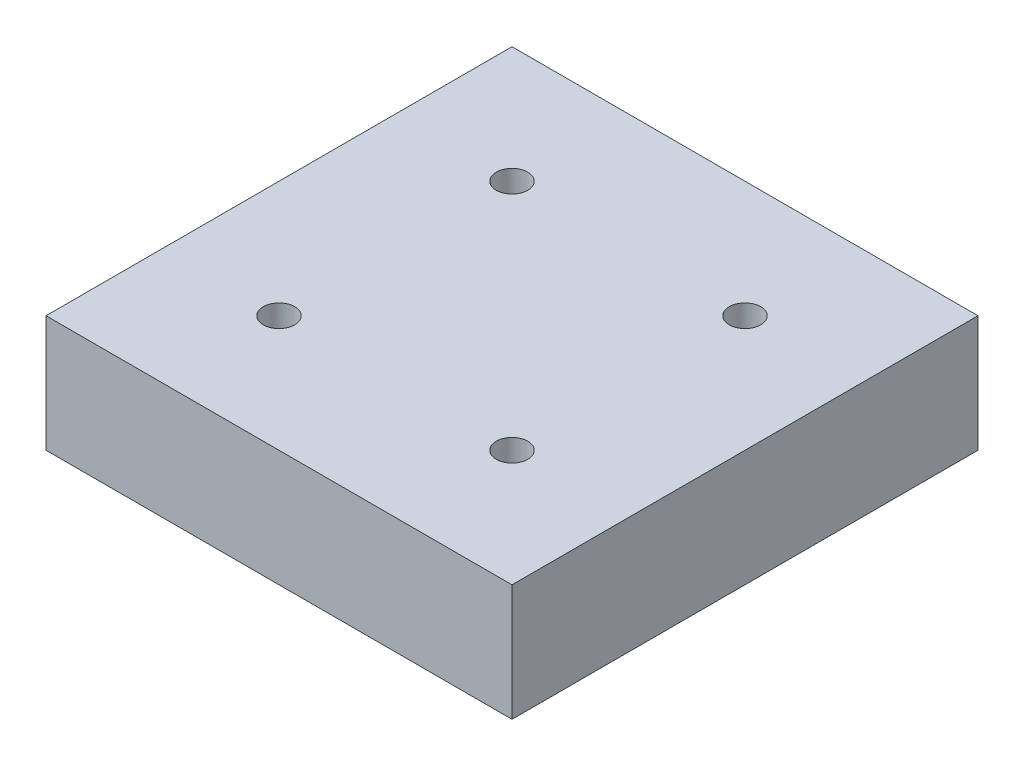
ISO-10303-21;
HEADER;
FILE_DESCRIPTION(('STEP AP214'),'2;1');
FILE_NAME('part.step','',(''),(''),'','','');
FILE_SCHEMA(('AUTOMOTIVE_DESIGN { 1 0 10303 214 1 1 1 1 }'));
ENDSEC;
DATA;
#1=APPLICATION_CONTEXT('core data for automotive mechanical design processes');
#2=APPLICATION_PROTOCOL_DEFINITION('international standard','automotive_design',2000,#1);
#3=PRODUCT_CONTEXT('',#1,'mechanical');
#4=PRODUCT('Part','Part','',(#3));
#5=PRODUCT_RELATED_PRODUCT_CATEGORY('part','',(#4));
#6=PRODUCT_DEFINITION_FORMATION('','',#4);
#7=PRODUCT_DEFINITION_CONTEXT('part definition',#1,'design');
#8=PRODUCT_DEFINITION('design','',#6,#7);
#9=PRODUCT_DEFINITION_SHAPE('','',#8);
#10=(LENGTH_UNIT() NAMED_UNIT(*) SI_UNIT(.MILLI.,.METRE.));
#11=(NAMED_UNIT(*) PLANE_ANGLE_UNIT() SI_UNIT($,.RADIAN.));
#12=(NAMED_UNIT(*) SI_UNIT($,.STERADIAN.) SOLID_ANGLE_UNIT());
#13=UNCERTAINTY_MEASURE_WITH_UNIT(LENGTH_MEASURE(1.E-05),#10,'distance_accuracy_value','');
#14=(GEOMETRIC_REPRESENTATION_CONTEXT(3) GLOBAL_UNCERTAINTY_ASSIGNED_CONTEXT((#13)) GLOBAL_UNIT_ASSIGNED_CONTEXT((#10,
#11,#12)) REPRESENTATION_CONTEXT('',''));
#15=CARTESIAN_POINT('',(0.,0.,0.));
#16=DIRECTION('',(0.,0.,1.));
#17=DIRECTION('',(1.,0.,0.));
#18=AXIS2_PLACEMENT_3D('',#15,#16,#17);
#19=CARTESIAN_POINT('',(0.,10.,0.));
#20=DIRECTION('',(0.,-1.,0.));
#21=DIRECTION('',(0.,0.,-1.));
#22=AXIS2_PLACEMENT_3D('',#19,#20,#21);
#23=PLANE('',#22);
#24=DIRECTION('',(-1.,0.,0.));
#25=VECTOR('',#24,1.);
#26=CARTESIAN_POINT('',(-20.,10.,-20.));
#27=LINE('',#26,#25);
#28=CARTESIAN_POINT('',(20.,10.,-20.));
#29=VERTEX_POINT('',#28);
#30=CARTESIAN_POINT('',(-20.,10.,-20.));
#31=VERTEX_POINT('',#30);
#32=EDGE_CURVE('E97',#29,#31,#27,.T.);
#33=ORIENTED_EDGE('',*,*,#32,.T.);
#34=DIRECTION('',(0.,0.,1.));
#35=VECTOR('',#34,1.);
#36=CARTESIAN_POINT('',(-20.,10.,20.));
#37=LINE('',#36,#35);
#38=CARTESIAN_POINT('',(-20.,10.,20.));
#39=VERTEX_POINT('',#38);
#40=EDGE_CURVE('E169',#31,#39,#37,.T.);
#41=ORIENTED_EDGE('',*,*,#40,.T.);
#42=DIRECTION('',(1.,0.,0.));
#43=VECTOR('',#42,1.);
#44=CARTESIAN_POINT('',(-20.,10.,20.));
#45=LINE('',#44,#43);
#46=CARTESIAN_POINT('',(20.,10.,20.));
#47=VERTEX_POINT('',#46);
#48=EDGE_CURVE('E70',#39,#47,#45,.T.);
#49=ORIENTED_EDGE('',*,*,#48,.T.);
#50=DIRECTION('',(0.,0.,-1.));
#51=VECTOR('',#50,1.);
#52=CARTESIAN_POINT('',(20.,10.,20.));
#53=LINE('',#52,#51);
#54=EDGE_CURVE('E164',#47,#29,#53,.T.);
#55=ORIENTED_EDGE('',*,*,#54,.T.);
#56=EDGE_LOOP('',(#33,#41,#49,#55));
#57=FACE_BOUND('',#56,.T.);
#58=CARTESIAN_POINT('',(-10.,10.,-10.));
#59=DIRECTION('',(0.,1.,0.));
#60=DIRECTION('',(0.,0.,1.));
#61=AXIS2_PLACEMENT_3D('',#58,#59,#60);
#62=CIRCLE('',#61,1.35);
#63=CARTESIAN_POINT('',(-10.,10.,-8.65));
#64=VERTEX_POINT('',#63);
#65=EDGE_CURVE('E156',#64,#64,#62,.T.);
#66=ORIENTED_EDGE('',*,*,#65,.F.);
#67=EDGE_LOOP('',(#66));
#68=FACE_BOUND('',#67,.T.);
#69=CARTESIAN_POINT('',(10.,10.,-10.));
#70=DIRECTION('',(0.,1.,0.));
#71=DIRECTION('',(0.,0.,-1.));
#72=AXIS2_PLACEMENT_3D('',#69,#70,#71);
#73=CIRCLE('',#72,1.35);
#74=CARTESIAN_POINT('',(10.,10.,-11.35));
#75=VERTEX_POINT('',#74);
#76=EDGE_CURVE('E148',#75,#75,#73,.T.);
#77=ORIENTED_EDGE('',*,*,#76,.F.);
#78=EDGE_LOOP('',(#77));
#79=FACE_BOUND('',#78,.T.);
#80=CARTESIAN_POINT('',(10.,10.,10.));
#81=DIRECTION('',(0.,1.,0.));
#82=DIRECTION('',(0.,0.,1.));
#83=AXIS2_PLACEMENT_3D('',#80,#81,#82);
#84=CIRCLE('',#83,1.35);
#85=CARTESIAN_POINT('',(10.,10.,11.35));
#86=VERTEX_POINT('',#85);
#87=EDGE_CURVE('E140',#86,#86,#84,.T.);
#88=ORIENTED_EDGE('',*,*,#87,.F.);
#89=EDGE_LOOP('',(#88));
#90=FACE_BOUND('',#89,.T.);
#91=CARTESIAN_POINT('',(-10.,10.,9.99999999999999));
#92=DIRECTION('',(0.,1.,0.));
#93=DIRECTION('',(0.,0.,-1.));
#94=AXIS2_PLACEMENT_3D('',#91,#92,#93);
#95=CIRCLE('',#94,1.35);
#96=CARTESIAN_POINT('',(-10.,10.,8.64999999999999));
#97=VERTEX_POINT('',#96);
#98=EDGE_CURVE('E131',#97,#97,#95,.T.);
#99=ORIENTED_EDGE('',*,*,#98,.F.);
#100=EDGE_LOOP('',(#99));
#101=FACE_BOUND('',#100,.T.);
#102=ADVANCED_FACE('F45',(#57,#68,#79,#90,#101),#23,.F.);
#103=CARTESIAN_POINT('',(0.,0.,0.));
#104=DIRECTION('',(0.,-1.,0.));
#105=DIRECTION('',(0.,0.,-1.));
#106=AXIS2_PLACEMENT_3D('',#103,#104,#105);
#107=PLANE('',#106);
#108=DIRECTION('',(0.,0.,-1.));
#109=VECTOR('',#108,1.);
#110=CARTESIAN_POINT('',(-10.,0.,-12.));
#111=LINE('',#110,#109);
#112=CARTESIAN_POINT('',(-10.,0.,-12.));
#113=VERTEX_POINT('',#112);
#114=CARTESIAN_POINT('',(-10.,0.,-20.));
#115=VERTEX_POINT('',#114);
#116=EDGE_CURVE('E116',#113,#115,#111,.T.);
#117=ORIENTED_EDGE('',*,*,#116,.F.);
#118=DIRECTION('',(1.,0.,0.));
#119=VECTOR('',#118,1.);
#120=CARTESIAN_POINT('',(0.,0.,-12.));
#121=LINE('',#120,#119);
#122=CARTESIAN_POINT('',(10.,0.,-12.));
#123=VERTEX_POINT('',#122);
#124=EDGE_CURVE('E11',#113,#123,#121,.T.);
#125=ORIENTED_EDGE('',*,*,#124,.T.);
#126=DIRECTION('',(0.,0.,-1.));
#127=VECTOR('',#126,1.);
#128=CARTESIAN_POINT('',(10.,0.,-12.));
#129=LINE('',#128,#127);
#130=CARTESIAN_POINT('',(10.,0.,-20.));
#131=VERTEX_POINT('',#130);
#132=EDGE_CURVE('E118',#131,#123,#129,.F.);
#133=ORIENTED_EDGE('',*,*,#132,.F.);
#134=DIRECTION('',(-1.,0.,0.));
#135=VECTOR('',#134,1.);
#136=CARTESIAN_POINT('',(-20.,0.,-20.));
#137=LINE('',#136,#135);
#138=CARTESIAN_POINT('',(20.,0.,-20.));
#139=VERTEX_POINT('',#138);
#140=EDGE_CURVE('E178',#139,#131,#137,.T.);
#141=ORIENTED_EDGE('',*,*,#140,.F.);
#142=DIRECTION('',(0.,0.,-1.));
#143=VECTOR('',#142,1.);
#144=CARTESIAN_POINT('',(20.,0.,20.));
#145=LINE('',#144,#143);
#146=CARTESIAN_POINT('',(20.,0.,20.));
#147=VERTEX_POINT('',#146);
#148=EDGE_CURVE('E160',#147,#139,#145,.T.);
#149=ORIENTED_EDGE('',*,*,#148,.F.);
#150=DIRECTION('',(1.,0.,0.));
#151=VECTOR('',#150,1.);
#152=CARTESIAN_POINT('',(-20.,0.,20.));
#153=LINE('',#152,#151);
#154=CARTESIAN_POINT('',(-20.,0.,20.));
#155=VERTEX_POINT('',#154);
#156=EDGE_CURVE('E90',#155,#147,#153,.T.);
#157=ORIENTED_EDGE('',*,*,#156,.F.);
#158=DIRECTION('',(0.,0.,1.));
#159=VECTOR('',#158,1.);
#160=CARTESIAN_POINT('',(-20.,0.,20.));
#161=LINE('',#160,#159);
#162=CARTESIAN_POINT('',(-20.,0.,-20.));
#163=VERTEX_POINT('',#162);
#164=EDGE_CURVE('E181',#163,#155,#161,.T.);
#165=ORIENTED_EDGE('',*,*,#164,.F.);
#166=EDGE_CURVE('E124',#115,#163,#137,.T.);
#167=ORIENTED_EDGE('',*,*,#166,.F.);
#168=EDGE_LOOP('',(#117,#125,#133,#141,#149,#157,#165,#167));
#169=FACE_BOUND('',#168,.T.);
#170=CARTESIAN_POINT('',(10.,0.,10.));
#171=DIRECTION('',(0.,1.,0.));
#172=DIRECTION('',(0.,0.,1.));
#173=AXIS2_PLACEMENT_3D('',#170,#171,#172);
#174=CIRCLE('',#173,1.35);
#175=CARTESIAN_POINT('',(10.,0.,11.35));
#176=VERTEX_POINT('',#175);
#177=EDGE_CURVE('E138',#176,#176,#174,.T.);
#178=ORIENTED_EDGE('',*,*,#177,.T.);
#179=EDGE_LOOP('',(#178));
#180=FACE_BOUND('',#179,.T.);
#181=CARTESIAN_POINT('',(-10.,0.,-10.));
#182=DIRECTION('',(0.,1.,0.));
#183=DIRECTION('',(0.,0.,1.));
#184=AXIS2_PLACEMENT_3D('',#181,#182,#183);
#185=CIRCLE('',#184,1.35);
#186=CARTESIAN_POINT('',(-10.,0.,-8.65));
#187=VERTEX_POINT('',#186);
#188=EDGE_CURVE('E152',#187,#187,#185,.T.);
#189=ORIENTED_EDGE('',*,*,#188,.T.);
#190=EDGE_LOOP('',(#189));
#191=FACE_BOUND('',#190,.T.);
#192=CARTESIAN_POINT('',(10.,0.,-10.));
#193=DIRECTION('',(0.,1.,0.));
#194=DIRECTION('',(0.,0.,-1.));
#195=AXIS2_PLACEMENT_3D('',#192,#193,#194);
#196=CIRCLE('',#195,1.35);
#197=CARTESIAN_POINT('',(10.,0.,-11.35));
#198=VERTEX_POINT('',#197);
#199=EDGE_CURVE('E144',#198,#198,#196,.T.);
#200=ORIENTED_EDGE('',*,*,#199,.T.);
#201=EDGE_LOOP('',(#200));
#202=FACE_BOUND('',#201,.T.);
#203=CARTESIAN_POINT('',(-10.,0.,9.99999999999999));
#204=DIRECTION('',(0.,1.,0.));
#205=DIRECTION('',(0.,0.,-1.));
#206=AXIS2_PLACEMENT_3D('',#203,#204,#205);
#207=CIRCLE('',#206,1.35);
#208=CARTESIAN_POINT('',(-10.,0.,8.64999999999999));
#209=VERTEX_POINT('',#208);
#210=EDGE_CURVE('E126',#209,#209,#207,.T.);
#211=ORIENTED_EDGE('',*,*,#210,.T.);
#212=EDGE_LOOP('',(#211));
#213=FACE_BOUND('',#212,.T.);
#214=ADVANCED_FACE('F121',(#169,#180,#191,#202,#213),#107,.T.);
#215=CARTESIAN_POINT('',(20.,10.,20.));
#216=DIRECTION('',(-1.,0.,0.));
#217=DIRECTION('',(0.,0.,1.));
#218=AXIS2_PLACEMENT_3D('',#215,#216,#217);
#219=PLANE('',#218);
#220=ORIENTED_EDGE('',*,*,#148,.T.);
#221=DIRECTION('',(0.,-1.,0.));
#222=VECTOR('',#221,1.);
#223=CARTESIAN_POINT('',(20.,10.,-20.));
#224=LINE('',#223,#222);
#225=EDGE_CURVE('E54',#29,#139,#224,.T.);
#226=ORIENTED_EDGE('',*,*,#225,.F.);
#227=ORIENTED_EDGE('',*,*,#54,.F.);
#228=DIRECTION('',(0.,-1.,0.));
#229=VECTOR('',#228,1.);
#230=CARTESIAN_POINT('',(20.,10.,20.));
#231=LINE('',#230,#229);
#232=EDGE_CURVE('E174',#47,#147,#231,.T.);
#233=ORIENTED_EDGE('',*,*,#232,.T.);
#234=EDGE_LOOP('',(#220,#226,#227,#233));
#235=FACE_BOUND('',#234,.T.);
#236=ADVANCED_FACE('F47',(#235),#219,.F.);
#237=CARTESIAN_POINT('',(-20.,10.,-20.));
#238=DIRECTION('',(0.,0.,1.));
#239=DIRECTION('',(1.,0.,0.));
#240=AXIS2_PLACEMENT_3D('',#237,#238,#239);
#241=PLANE('',#240);
#242=DIRECTION('',(0.,-1.,0.));
#243=VECTOR('',#242,1.);
#244=CARTESIAN_POINT('',(-20.,10.,-20.));
#245=LINE('',#244,#243);
#246=EDGE_CURVE('E191',#31,#163,#245,.T.);
#247=ORIENTED_EDGE('',*,*,#246,.F.);
#248=ORIENTED_EDGE('',*,*,#32,.F.);
#249=ORIENTED_EDGE('',*,*,#225,.T.);
#250=ORIENTED_EDGE('',*,*,#140,.T.);
#251=CARTESIAN_POINT('',(0.,0.,-20.));
#252=DIRECTION('',(0.,0.,-1.));
#253=DIRECTION('',(-1.,0.,0.));
#254=AXIS2_PLACEMENT_3D('',#251,#252,#253);
#255=CIRCLE('',#254,10.);
#256=EDGE_CURVE('E61',#131,#115,#255,.T.);
#257=ORIENTED_EDGE('',*,*,#256,.T.);
#258=ORIENTED_EDGE('',*,*,#166,.T.);
#259=EDGE_LOOP('',(#247,#248,#249,#250,#257,#258));
#260=FACE_BOUND('',#259,.T.);
#261=CARTESIAN_POINT('',(0.,-6.,-20.));
#262=DIRECTION('',(0.,0.,-1.));
#263=DIRECTION('',(-1.,0.,0.));
#264=AXIS2_PLACEMENT_3D('',#261,#262,#263);
#265=CIRCLE('',#264,1.9);
#266=CARTESIAN_POINT('',(-1.9,-6.,-20.));
#267=VERTEX_POINT('',#266);
#268=EDGE_CURVE('E347',#267,#267,#265,.T.);
#269=ORIENTED_EDGE('',*,*,#268,.F.);
#270=EDGE_LOOP('',(#269));
#271=FACE_BOUND('',#270,.T.);
#272=ADVANCED_FACE('F196',(#260,#271),#241,.F.);
#273=CARTESIAN_POINT('',(-20.,10.,20.));
#274=DIRECTION('',(1.,0.,0.));
#275=DIRECTION('',(0.,0.,-1.));
#276=AXIS2_PLACEMENT_3D('',#273,#274,#275);
#277=PLANE('',#276);
#278=ORIENTED_EDGE('',*,*,#164,.T.);
#279=DIRECTION('',(0.,-1.,0.));
#280=VECTOR('',#279,1.);
#281=CARTESIAN_POINT('',(-20.,10.,20.));
#282=LINE('',#281,#280);
#283=EDGE_CURVE('E188',#39,#155,#282,.T.);
#284=ORIENTED_EDGE('',*,*,#283,.F.);
#285=ORIENTED_EDGE('',*,*,#40,.F.);
#286=ORIENTED_EDGE('',*,*,#246,.T.);
#287=EDGE_LOOP('',(#278,#284,#285,#286));
#288=FACE_BOUND('',#287,.T.);
#289=ADVANCED_FACE('F203',(#288),#277,.F.);
#290=CARTESIAN_POINT('',(-20.,10.,20.));
#291=DIRECTION('',(0.,0.,-1.));
#292=DIRECTION('',(-1.,0.,0.));
#293=AXIS2_PLACEMENT_3D('',#290,#291,#292);
#294=PLANE('',#293);
#295=ORIENTED_EDGE('',*,*,#156,.T.);
#296=ORIENTED_EDGE('',*,*,#232,.F.);
#297=ORIENTED_EDGE('',*,*,#48,.F.);
#298=ORIENTED_EDGE('',*,*,#283,.T.);
#299=EDGE_LOOP('',(#295,#296,#297,#298));
#300=FACE_BOUND('',#299,.T.);
#301=ADVANCED_FACE('F205',(#300),#294,.F.);
#302=CARTESIAN_POINT('',(-10.,10.,-10.));
#303=DIRECTION('',(0.,-1.,0.));
#304=DIRECTION('',(0.,0.,-1.));
#305=AXIS2_PLACEMENT_3D('',#302,#303,#304);
#306=CYLINDRICAL_SURFACE('',#305,1.35);
#307=ORIENTED_EDGE('',*,*,#65,.T.);
#308=EDGE_LOOP('',(#307));
#309=FACE_BOUND('',#308,.T.);
#310=ORIENTED_EDGE('',*,*,#188,.F.);
#311=EDGE_LOOP('',(#310));
#312=FACE_BOUND('',#311,.T.);
#313=ADVANCED_FACE('F235',(#309,#312),#306,.F.);
#314=CARTESIAN_POINT('',(10.,10.,-10.));
#315=DIRECTION('',(0.,-1.,0.));
#316=DIRECTION('',(0.,0.,-1.));
#317=AXIS2_PLACEMENT_3D('',#314,#315,#316);
#318=CYLINDRICAL_SURFACE('',#317,1.35);
#319=ORIENTED_EDGE('',*,*,#76,.T.);
#320=EDGE_LOOP('',(#319));
#321=FACE_BOUND('',#320,.T.);
#322=ORIENTED_EDGE('',*,*,#199,.F.);
#323=EDGE_LOOP('',(#322));
#324=FACE_BOUND('',#323,.T.);
#325=ADVANCED_FACE('F278',(#321,#324),#318,.F.);
#326=CARTESIAN_POINT('',(10.,10.,10.));
#327=DIRECTION('',(0.,-1.,0.));
#328=DIRECTION('',(0.,0.,-1.));
#329=AXIS2_PLACEMENT_3D('',#326,#327,#328);
#330=CYLINDRICAL_SURFACE('',#329,1.35);
#331=ORIENTED_EDGE('',*,*,#87,.T.);
#332=EDGE_LOOP('',(#331));
#333=FACE_BOUND('',#332,.T.);
#334=ORIENTED_EDGE('',*,*,#177,.F.);
#335=EDGE_LOOP('',(#334));
#336=FACE_BOUND('',#335,.T.);
#337=ADVANCED_FACE('F221',(#333,#336),#330,.F.);
#338=CARTESIAN_POINT('',(-10.,10.,9.99999999999999));
#339=DIRECTION('',(0.,-1.,0.));
#340=DIRECTION('',(0.,0.,-1.));
#341=AXIS2_PLACEMENT_3D('',#338,#339,#340);
#342=CYLINDRICAL_SURFACE('',#341,1.35);
#343=ORIENTED_EDGE('',*,*,#98,.T.);
#344=EDGE_LOOP('',(#343));
#345=FACE_BOUND('',#344,.T.);
#346=ORIENTED_EDGE('',*,*,#210,.F.);
#347=EDGE_LOOP('',(#346));
#348=FACE_BOUND('',#347,.T.);
#349=ADVANCED_FACE('F218',(#345,#348),#342,.F.);
#350=CARTESIAN_POINT('',(0.,0.,-12.));
#351=DIRECTION('',(0.,0.,-1.));
#352=DIRECTION('',(-1.,0.,0.));
#353=AXIS2_PLACEMENT_3D('',#350,#351,#352);
#354=CYLINDRICAL_SURFACE('',#353,10.);
#355=CARTESIAN_POINT('',(0.,0.,-12.));
#356=DIRECTION('',(0.,0.,-1.));
#357=DIRECTION('',(-1.,0.,0.));
#358=AXIS2_PLACEMENT_3D('',#355,#356,#357);
#359=CIRCLE('',#358,10.);
#360=EDGE_CURVE('E110',#123,#113,#359,.T.);
#361=ORIENTED_EDGE('',*,*,#360,.T.);
#362=ORIENTED_EDGE('',*,*,#116,.T.);
#363=ORIENTED_EDGE('',*,*,#256,.F.);
#364=ORIENTED_EDGE('',*,*,#132,.T.);
#365=EDGE_LOOP('',(#361,#362,#363,#364));
#366=FACE_BOUND('',#365,.T.);
#367=ADVANCED_FACE('F115',(#366),#354,.T.);
#368=CARTESIAN_POINT('',(0.,0.,-12.));
#369=DIRECTION('',(0.,0.,-1.));
#370=DIRECTION('',(-1.,0.,0.));
#371=AXIS2_PLACEMENT_3D('',#368,#369,#370);
#372=PLANE('',#371);
#373=ORIENTED_EDGE('',*,*,#124,.F.);
#374=ORIENTED_EDGE('',*,*,#360,.F.);
#375=EDGE_LOOP('',(#373,#374));
#376=FACE_BOUND('',#375,.T.);
#377=CARTESIAN_POINT('',(0.,-6.,-12.));
#378=DIRECTION('',(0.,0.,-1.));
#379=DIRECTION('',(-1.,0.,0.));
#380=AXIS2_PLACEMENT_3D('',#377,#378,#379);
#381=CIRCLE('',#380,1.9);
#382=CARTESIAN_POINT('',(-1.9,-6.,-12.));
#383=VERTEX_POINT('',#382);
#384=EDGE_CURVE('E344',#383,#383,#381,.T.);
#385=ORIENTED_EDGE('',*,*,#384,.T.);
#386=EDGE_LOOP('',(#385));
#387=FACE_BOUND('',#386,.T.);
#388=ADVANCED_FACE('F108',(#376,#387),#372,.F.);
#389=CARTESIAN_POINT('',(0.,-6.,-12.));
#390=DIRECTION('',(0.,0.,-1.));
#391=DIRECTION('',(-1.,0.,0.));
#392=AXIS2_PLACEMENT_3D('',#389,#390,#391);
#393=CYLINDRICAL_SURFACE('',#392,1.9);
#394=ORIENTED_EDGE('',*,*,#384,.F.);
#395=EDGE_LOOP('',(#394));
#396=FACE_BOUND('',#395,.T.);
#397=ORIENTED_EDGE('',*,*,#268,.T.);
#398=EDGE_LOOP('',(#397));
#399=FACE_BOUND('',#398,.T.);
#400=ADVANCED_FACE('F254',(#396,#399),#393,.F.);
#401=CLOSED_SHELL('',(#102,#214,#236,#272,#289,#301,#313,#325,#337,#349,#367,#388,#400));
#402=MANIFOLD_SOLID_BREP('B2',#401);
#403=ADVANCED_BREP_SHAPE_REPRESENTATION('',(#18,#402),#14);
#404=SHAPE_DEFINITION_REPRESENTATION(#9,#403);
ENDSEC;
END-ISO-10303-21;
